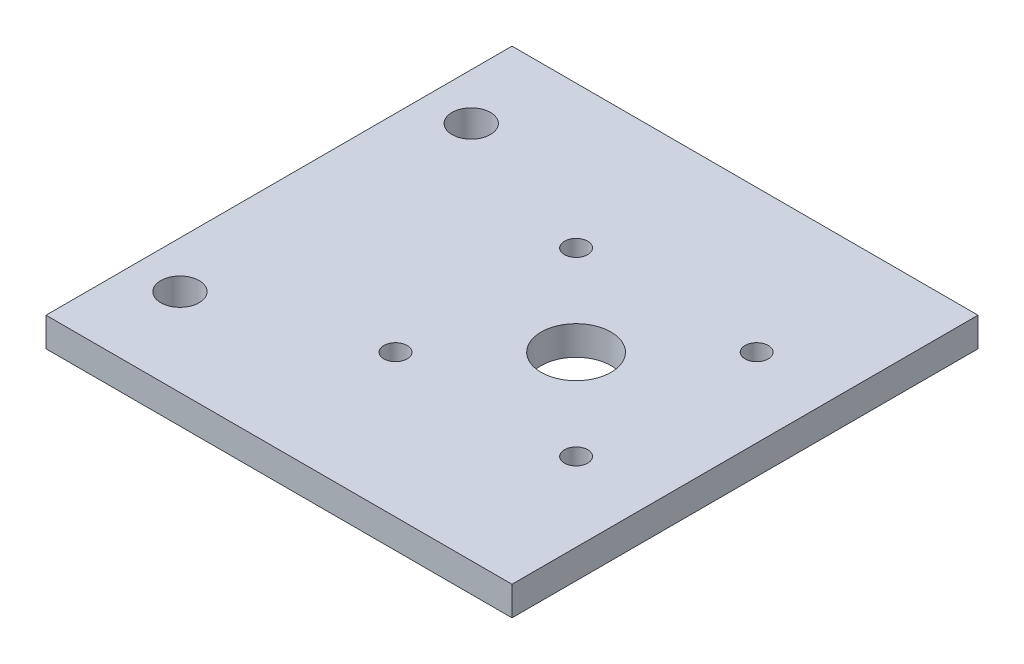
ISO-10303-21;
HEADER;
FILE_DESCRIPTION(('STEP AP214'),'2;1');
FILE_NAME('part.step','',(''),(''),'','','');
FILE_SCHEMA(('AUTOMOTIVE_DESIGN { 1 0 10303 214 1 1 1 1 }'));
ENDSEC;
DATA;
#1=APPLICATION_CONTEXT('core data for automotive mechanical design processes');
#2=APPLICATION_PROTOCOL_DEFINITION('international standard','automotive_design',2000,#1);
#3=PRODUCT_CONTEXT('',#1,'mechanical');
#4=PRODUCT('Part','Part','',(#3));
#5=PRODUCT_RELATED_PRODUCT_CATEGORY('part','',(#4));
#6=PRODUCT_DEFINITION_FORMATION('','',#4);
#7=PRODUCT_DEFINITION_CONTEXT('part definition',#1,'design');
#8=PRODUCT_DEFINITION('design','',#6,#7);
#9=PRODUCT_DEFINITION_SHAPE('','',#8);
#10=(LENGTH_UNIT() NAMED_UNIT(*) SI_UNIT(.MILLI.,.METRE.));
#11=(NAMED_UNIT(*) PLANE_ANGLE_UNIT() SI_UNIT($,.RADIAN.));
#12=(NAMED_UNIT(*) SI_UNIT($,.STERADIAN.) SOLID_ANGLE_UNIT());
#13=UNCERTAINTY_MEASURE_WITH_UNIT(LENGTH_MEASURE(1.E-05),#10,'distance_accuracy_value','');
#14=(GEOMETRIC_REPRESENTATION_CONTEXT(3) GLOBAL_UNCERTAINTY_ASSIGNED_CONTEXT((#13)) GLOBAL_UNIT_ASSIGNED_CONTEXT((#10,
#11,#12)) REPRESENTATION_CONTEXT('',''));
#15=CARTESIAN_POINT('',(0.,0.,0.));
#16=DIRECTION('',(0.,0.,1.));
#17=DIRECTION('',(1.,0.,0.));
#18=AXIS2_PLACEMENT_3D('',#15,#16,#17);
#19=CARTESIAN_POINT('',(0.,0.,80.));
#20=DIRECTION('',(1.,0.,0.));
#21=DIRECTION('',(0.,0.,-1.));
#22=AXIS2_PLACEMENT_3D('',#19,#20,#21);
#23=PLANE('',#22);
#24=DIRECTION('',(0.,-1.,0.));
#25=VECTOR('',#24,1.);
#26=CARTESIAN_POINT('',(0.,0.,0.));
#27=LINE('',#26,#25);
#28=CARTESIAN_POINT('',(0.,5.,0.));
#29=VERTEX_POINT('',#28);
#30=CARTESIAN_POINT('',(0.,0.,0.));
#31=VERTEX_POINT('',#30);
#32=EDGE_CURVE('E96',#29,#31,#27,.T.);
#33=ORIENTED_EDGE('',*,*,#32,.T.);
#34=DIRECTION('',(0.,0.,-1.));
#35=VECTOR('',#34,1.);
#36=CARTESIAN_POINT('',(0.,0.,80.));
#37=LINE('',#36,#35);
#38=CARTESIAN_POINT('',(0.,0.,80.));
#39=VERTEX_POINT('',#38);
#40=EDGE_CURVE('E11',#39,#31,#37,.T.);
#41=ORIENTED_EDGE('',*,*,#40,.F.);
#42=DIRECTION('',(0.,-1.,0.));
#43=VECTOR('',#42,1.);
#44=CARTESIAN_POINT('',(0.,0.,80.));
#45=LINE('',#44,#43);
#46=CARTESIAN_POINT('',(0.,5.,80.));
#47=VERTEX_POINT('',#46);
#48=EDGE_CURVE('E84',#47,#39,#45,.T.);
#49=ORIENTED_EDGE('',*,*,#48,.F.);
#50=DIRECTION('',(0.,0.,-1.));
#51=VECTOR('',#50,1.);
#52=CARTESIAN_POINT('',(0.,5.,80.));
#53=LINE('',#52,#51);
#54=EDGE_CURVE('E92',#47,#29,#53,.T.);
#55=ORIENTED_EDGE('',*,*,#54,.T.);
#56=EDGE_LOOP('',(#33,#41,#49,#55));
#57=FACE_BOUND('',#56,.T.);
#58=ADVANCED_FACE('F33',(#57),#23,.F.);
#59=CARTESIAN_POINT('',(0.,0.,80.));
#60=DIRECTION('',(0.,1.,0.));
#61=DIRECTION('',(0.,0.,1.));
#62=AXIS2_PLACEMENT_3D('',#59,#60,#61);
#63=PLANE('',#62);
#64=CARTESIAN_POINT('',(35.5,0.,55.5));
#65=DIRECTION('',(0.,1.,0.));
#66=DIRECTION('',(0.,0.,1.));
#67=AXIS2_PLACEMENT_3D('',#64,#65,#66);
#68=CIRCLE('',#67,2.);
#69=CARTESIAN_POINT('',(35.5,0.,57.5));
#70=VERTEX_POINT('',#69);
#71=EDGE_CURVE('E143',#70,#70,#68,.T.);
#72=ORIENTED_EDGE('',*,*,#71,.T.);
#73=EDGE_LOOP('',(#72));
#74=FACE_BOUND('',#73,.T.);
#75=CARTESIAN_POINT('',(66.5,0.,55.5));
#76=DIRECTION('',(0.,1.,0.));
#77=DIRECTION('',(0.,0.,1.));
#78=AXIS2_PLACEMENT_3D('',#75,#76,#77);
#79=CIRCLE('',#78,2.);
#80=CARTESIAN_POINT('',(66.5,0.,57.5));
#81=VERTEX_POINT('',#80);
#82=EDGE_CURVE('E137',#81,#81,#79,.T.);
#83=ORIENTED_EDGE('',*,*,#82,.T.);
#84=EDGE_LOOP('',(#83));
#85=FACE_BOUND('',#84,.T.);
#86=CARTESIAN_POINT('',(66.5,0.,24.5));
#87=DIRECTION('',(0.,1.,0.));
#88=DIRECTION('',(0.,0.,1.));
#89=AXIS2_PLACEMENT_3D('',#86,#87,#88);
#90=CIRCLE('',#89,2.);
#91=CARTESIAN_POINT('',(66.5,0.,26.5));
#92=VERTEX_POINT('',#91);
#93=EDGE_CURVE('E131',#92,#92,#90,.T.);
#94=ORIENTED_EDGE('',*,*,#93,.T.);
#95=EDGE_LOOP('',(#94));
#96=FACE_BOUND('',#95,.T.);
#97=CARTESIAN_POINT('',(35.5,0.,24.5));
#98=DIRECTION('',(0.,1.,0.));
#99=DIRECTION('',(0.,0.,1.));
#100=AXIS2_PLACEMENT_3D('',#97,#98,#99);
#101=CIRCLE('',#100,2.);
#102=CARTESIAN_POINT('',(35.5,0.,26.5));
#103=VERTEX_POINT('',#102);
#104=EDGE_CURVE('E125',#103,#103,#101,.T.);
#105=ORIENTED_EDGE('',*,*,#104,.T.);
#106=EDGE_LOOP('',(#105));
#107=FACE_BOUND('',#106,.T.);
#108=CARTESIAN_POINT('',(51.,0.,40.));
#109=DIRECTION('',(0.,1.,0.));
#110=DIRECTION('',(0.,0.,1.));
#111=AXIS2_PLACEMENT_3D('',#108,#109,#110);
#112=CIRCLE('',#111,5.99999999999999);
#113=CARTESIAN_POINT('',(51.,0.,46.));
#114=VERTEX_POINT('',#113);
#115=EDGE_CURVE('E121',#114,#114,#112,.T.);
#116=ORIENTED_EDGE('',*,*,#115,.T.);
#117=EDGE_LOOP('',(#116));
#118=FACE_BOUND('',#117,.T.);
#119=CARTESIAN_POINT('',(8.,0.,15.));
#120=DIRECTION('',(0.,1.,0.));
#121=DIRECTION('',(0.,0.,1.));
#122=AXIS2_PLACEMENT_3D('',#119,#120,#121);
#123=CIRCLE('',#122,3.3);
#124=CARTESIAN_POINT('',(8.,0.,18.3));
#125=VERTEX_POINT('',#124);
#126=EDGE_CURVE('E115',#125,#125,#123,.T.);
#127=ORIENTED_EDGE('',*,*,#126,.T.);
#128=EDGE_LOOP('',(#127));
#129=FACE_BOUND('',#128,.T.);
#130=CARTESIAN_POINT('',(8.,0.,65.));
#131=DIRECTION('',(0.,1.,0.));
#132=DIRECTION('',(0.,0.,1.));
#133=AXIS2_PLACEMENT_3D('',#130,#131,#132);
#134=CIRCLE('',#133,3.3);
#135=CARTESIAN_POINT('',(8.,0.,68.3));
#136=VERTEX_POINT('',#135);
#137=EDGE_CURVE('E99',#136,#136,#134,.T.);
#138=ORIENTED_EDGE('',*,*,#137,.T.);
#139=EDGE_LOOP('',(#138));
#140=FACE_BOUND('',#139,.T.);
#141=DIRECTION('',(1.,0.,0.));
#142=VECTOR('',#141,1.);
#143=CARTESIAN_POINT('',(0.,0.,0.));
#144=LINE('',#143,#142);
#145=CARTESIAN_POINT('',(80.,0.,0.));
#146=VERTEX_POINT('',#145);
#147=EDGE_CURVE('E88',#31,#146,#144,.T.);
#148=ORIENTED_EDGE('',*,*,#147,.T.);
#149=DIRECTION('',(0.,0.,-1.));
#150=VECTOR('',#149,1.);
#151=CARTESIAN_POINT('',(80.,0.,80.));
#152=LINE('',#151,#150);
#153=CARTESIAN_POINT('',(80.,0.,80.));
#154=VERTEX_POINT('',#153);
#155=EDGE_CURVE('E41',#154,#146,#152,.T.);
#156=ORIENTED_EDGE('',*,*,#155,.F.);
#157=DIRECTION('',(1.,0.,0.));
#158=VECTOR('',#157,1.);
#159=CARTESIAN_POINT('',(0.,0.,80.));
#160=LINE('',#159,#158);
#161=EDGE_CURVE('E79',#39,#154,#160,.T.);
#162=ORIENTED_EDGE('',*,*,#161,.F.);
#163=ORIENTED_EDGE('',*,*,#40,.T.);
#164=EDGE_LOOP('',(#148,#156,#162,#163));
#165=FACE_BOUND('',#164,.T.);
#166=ADVANCED_FACE('F87',(#74,#85,#96,#107,#118,#129,#140,#165),#63,.F.);
#167=CARTESIAN_POINT('',(80.,0.,80.));
#168=DIRECTION('',(-1.,0.,0.));
#169=DIRECTION('',(0.,0.,1.));
#170=AXIS2_PLACEMENT_3D('',#167,#168,#169);
#171=PLANE('',#170);
#172=DIRECTION('',(0.,1.,0.));
#173=VECTOR('',#172,1.);
#174=CARTESIAN_POINT('',(80.,0.,0.));
#175=LINE('',#174,#173);
#176=CARTESIAN_POINT('',(80.,5.,0.));
#177=VERTEX_POINT('',#176);
#178=EDGE_CURVE('E66',#146,#177,#175,.T.);
#179=ORIENTED_EDGE('',*,*,#178,.T.);
#180=DIRECTION('',(0.,0.,-1.));
#181=VECTOR('',#180,1.);
#182=CARTESIAN_POINT('',(80.,5.,80.));
#183=LINE('',#182,#181);
#184=CARTESIAN_POINT('',(80.,5.,80.));
#185=VERTEX_POINT('',#184);
#186=EDGE_CURVE('E89',#185,#177,#183,.T.);
#187=ORIENTED_EDGE('',*,*,#186,.F.);
#188=DIRECTION('',(0.,1.,0.));
#189=VECTOR('',#188,1.);
#190=CARTESIAN_POINT('',(80.,0.,80.));
#191=LINE('',#190,#189);
#192=EDGE_CURVE('E82',#154,#185,#191,.T.);
#193=ORIENTED_EDGE('',*,*,#192,.F.);
#194=ORIENTED_EDGE('',*,*,#155,.T.);
#195=EDGE_LOOP('',(#179,#187,#193,#194));
#196=FACE_BOUND('',#195,.T.);
#197=ADVANCED_FACE('F90',(#196),#171,.F.);
#198=CARTESIAN_POINT('',(0.,5.,80.));
#199=DIRECTION('',(0.,-1.,0.));
#200=DIRECTION('',(0.,0.,-1.));
#201=AXIS2_PLACEMENT_3D('',#198,#199,#200);
#202=PLANE('',#201);
#203=CARTESIAN_POINT('',(35.5,5.,55.5));
#204=DIRECTION('',(0.,1.,0.));
#205=DIRECTION('',(0.,0.,1.));
#206=AXIS2_PLACEMENT_3D('',#203,#204,#205);
#207=CIRCLE('',#206,2.);
#208=CARTESIAN_POINT('',(35.5,5.,57.5));
#209=VERTEX_POINT('',#208);
#210=EDGE_CURVE('E146',#209,#209,#207,.T.);
#211=ORIENTED_EDGE('',*,*,#210,.F.);
#212=EDGE_LOOP('',(#211));
#213=FACE_BOUND('',#212,.T.);
#214=CARTESIAN_POINT('',(66.5,5.,55.5));
#215=DIRECTION('',(0.,1.,0.));
#216=DIRECTION('',(0.,0.,1.));
#217=AXIS2_PLACEMENT_3D('',#214,#215,#216);
#218=CIRCLE('',#217,2.);
#219=CARTESIAN_POINT('',(66.5,5.,57.5));
#220=VERTEX_POINT('',#219);
#221=EDGE_CURVE('E140',#220,#220,#218,.T.);
#222=ORIENTED_EDGE('',*,*,#221,.F.);
#223=EDGE_LOOP('',(#222));
#224=FACE_BOUND('',#223,.T.);
#225=CARTESIAN_POINT('',(66.5,5.,24.5));
#226=DIRECTION('',(0.,1.,0.));
#227=DIRECTION('',(0.,0.,1.));
#228=AXIS2_PLACEMENT_3D('',#225,#226,#227);
#229=CIRCLE('',#228,2.);
#230=CARTESIAN_POINT('',(66.5,5.,26.5));
#231=VERTEX_POINT('',#230);
#232=EDGE_CURVE('E134',#231,#231,#229,.T.);
#233=ORIENTED_EDGE('',*,*,#232,.F.);
#234=EDGE_LOOP('',(#233));
#235=FACE_BOUND('',#234,.T.);
#236=CARTESIAN_POINT('',(35.5,5.,24.5));
#237=DIRECTION('',(0.,1.,0.));
#238=DIRECTION('',(0.,0.,1.));
#239=AXIS2_PLACEMENT_3D('',#236,#237,#238);
#240=CIRCLE('',#239,2.);
#241=CARTESIAN_POINT('',(35.5,5.,26.5));
#242=VERTEX_POINT('',#241);
#243=EDGE_CURVE('E128',#242,#242,#240,.T.);
#244=ORIENTED_EDGE('',*,*,#243,.F.);
#245=EDGE_LOOP('',(#244));
#246=FACE_BOUND('',#245,.T.);
#247=CARTESIAN_POINT('',(51.,5.,40.));
#248=DIRECTION('',(0.,1.,0.));
#249=DIRECTION('',(0.,0.,1.));
#250=AXIS2_PLACEMENT_3D('',#247,#248,#249);
#251=CIRCLE('',#250,5.99999999999999);
#252=CARTESIAN_POINT('',(51.,5.,46.));
#253=VERTEX_POINT('',#252);
#254=EDGE_CURVE('E122',#253,#253,#251,.T.);
#255=ORIENTED_EDGE('',*,*,#254,.F.);
#256=EDGE_LOOP('',(#255));
#257=FACE_BOUND('',#256,.T.);
#258=CARTESIAN_POINT('',(8.,5.,15.));
#259=DIRECTION('',(0.,1.,0.));
#260=DIRECTION('',(0.,0.,1.));
#261=AXIS2_PLACEMENT_3D('',#258,#259,#260);
#262=CIRCLE('',#261,3.29999999999999);
#263=CARTESIAN_POINT('',(8.,5.,18.3));
#264=VERTEX_POINT('',#263);
#265=EDGE_CURVE('E118',#264,#264,#262,.T.);
#266=ORIENTED_EDGE('',*,*,#265,.F.);
#267=EDGE_LOOP('',(#266));
#268=FACE_BOUND('',#267,.T.);
#269=CARTESIAN_POINT('',(8.,5.,65.));
#270=DIRECTION('',(0.,1.,0.));
#271=DIRECTION('',(0.,0.,1.));
#272=AXIS2_PLACEMENT_3D('',#269,#270,#271);
#273=CIRCLE('',#272,3.29999999999999);
#274=CARTESIAN_POINT('',(8.,5.,68.3));
#275=VERTEX_POINT('',#274);
#276=EDGE_CURVE('E112',#275,#275,#273,.T.);
#277=ORIENTED_EDGE('',*,*,#276,.F.);
#278=EDGE_LOOP('',(#277));
#279=FACE_BOUND('',#278,.T.);
#280=DIRECTION('',(-1.,0.,0.));
#281=VECTOR('',#280,1.);
#282=CARTESIAN_POINT('',(0.,5.,0.));
#283=LINE('',#282,#281);
#284=EDGE_CURVE('E72',#177,#29,#283,.T.);
#285=ORIENTED_EDGE('',*,*,#284,.T.);
#286=ORIENTED_EDGE('',*,*,#54,.F.);
#287=DIRECTION('',(-1.,0.,0.));
#288=VECTOR('',#287,1.);
#289=CARTESIAN_POINT('',(0.,5.,80.));
#290=LINE('',#289,#288);
#291=EDGE_CURVE('E49',#185,#47,#290,.T.);
#292=ORIENTED_EDGE('',*,*,#291,.F.);
#293=ORIENTED_EDGE('',*,*,#186,.T.);
#294=EDGE_LOOP('',(#285,#286,#292,#293));
#295=FACE_BOUND('',#294,.T.);
#296=ADVANCED_FACE('F104',(#213,#224,#235,#246,#257,#268,#279,#295),#202,.F.);
#297=CARTESIAN_POINT('',(0.,0.,80.));
#298=DIRECTION('',(0.,0.,-1.));
#299=DIRECTION('',(-1.,0.,0.));
#300=AXIS2_PLACEMENT_3D('',#297,#298,#299);
#301=PLANE('',#300);
#302=ORIENTED_EDGE('',*,*,#48,.T.);
#303=ORIENTED_EDGE('',*,*,#161,.T.);
#304=ORIENTED_EDGE('',*,*,#192,.T.);
#305=ORIENTED_EDGE('',*,*,#291,.T.);
#306=EDGE_LOOP('',(#302,#303,#304,#305));
#307=FACE_BOUND('',#306,.T.);
#308=ADVANCED_FACE('F80',(#307),#301,.F.);
#309=CARTESIAN_POINT('',(0.,0.,0.));
#310=DIRECTION('',(0.,0.,-1.));
#311=DIRECTION('',(-1.,0.,0.));
#312=AXIS2_PLACEMENT_3D('',#309,#310,#311);
#313=PLANE('',#312);
#314=ORIENTED_EDGE('',*,*,#32,.F.);
#315=ORIENTED_EDGE('',*,*,#284,.F.);
#316=ORIENTED_EDGE('',*,*,#178,.F.);
#317=ORIENTED_EDGE('',*,*,#147,.F.);
#318=EDGE_LOOP('',(#314,#315,#316,#317));
#319=FACE_BOUND('',#318,.T.);
#320=ADVANCED_FACE('F107',(#319),#313,.T.);
#321=CARTESIAN_POINT('',(8.,5.,65.));
#322=DIRECTION('',(0.,1.,0.));
#323=DIRECTION('',(0.,0.,1.));
#324=AXIS2_PLACEMENT_3D('',#321,#322,#323);
#325=CYLINDRICAL_SURFACE('',#324,3.29999999999999);
#326=ORIENTED_EDGE('',*,*,#137,.F.);
#327=EDGE_LOOP('',(#326));
#328=FACE_BOUND('',#327,.T.);
#329=ORIENTED_EDGE('',*,*,#276,.T.);
#330=EDGE_LOOP('',(#329));
#331=FACE_BOUND('',#330,.T.);
#332=ADVANCED_FACE('F176',(#328,#331),#325,.F.);
#333=CARTESIAN_POINT('',(8.,5.,15.));
#334=DIRECTION('',(0.,1.,0.));
#335=DIRECTION('',(0.,0.,1.));
#336=AXIS2_PLACEMENT_3D('',#333,#334,#335);
#337=CYLINDRICAL_SURFACE('',#336,3.29999999999999);
#338=ORIENTED_EDGE('',*,*,#126,.F.);
#339=EDGE_LOOP('',(#338));
#340=FACE_BOUND('',#339,.T.);
#341=ORIENTED_EDGE('',*,*,#265,.T.);
#342=EDGE_LOOP('',(#341));
#343=FACE_BOUND('',#342,.T.);
#344=ADVANCED_FACE('F178',(#340,#343),#337,.F.);
#345=CARTESIAN_POINT('',(51.,0.,40.));
#346=DIRECTION('',(0.,1.,0.));
#347=DIRECTION('',(0.,0.,1.));
#348=AXIS2_PLACEMENT_3D('',#345,#346,#347);
#349=CYLINDRICAL_SURFACE('',#348,5.99999999999999);
#350=ORIENTED_EDGE('',*,*,#115,.F.);
#351=EDGE_LOOP('',(#350));
#352=FACE_BOUND('',#351,.T.);
#353=ORIENTED_EDGE('',*,*,#254,.T.);
#354=EDGE_LOOP('',(#353));
#355=FACE_BOUND('',#354,.T.);
#356=ADVANCED_FACE('F185',(#352,#355),#349,.F.);
#357=CARTESIAN_POINT('',(35.5,0.,24.5));
#358=DIRECTION('',(0.,1.,0.));
#359=DIRECTION('',(0.,0.,1.));
#360=AXIS2_PLACEMENT_3D('',#357,#358,#359);
#361=CYLINDRICAL_SURFACE('',#360,2.);
#362=ORIENTED_EDGE('',*,*,#104,.F.);
#363=EDGE_LOOP('',(#362));
#364=FACE_BOUND('',#363,.T.);
#365=ORIENTED_EDGE('',*,*,#243,.T.);
#366=EDGE_LOOP('',(#365));
#367=FACE_BOUND('',#366,.T.);
#368=ADVANCED_FACE('F227',(#364,#367),#361,.F.);
#369=CARTESIAN_POINT('',(66.5,0.,24.5));
#370=DIRECTION('',(0.,1.,0.));
#371=DIRECTION('',(0.,0.,1.));
#372=AXIS2_PLACEMENT_3D('',#369,#370,#371);
#373=CYLINDRICAL_SURFACE('',#372,2.);
#374=ORIENTED_EDGE('',*,*,#93,.F.);
#375=EDGE_LOOP('',(#374));
#376=FACE_BOUND('',#375,.T.);
#377=ORIENTED_EDGE('',*,*,#232,.T.);
#378=EDGE_LOOP('',(#377));
#379=FACE_BOUND('',#378,.T.);
#380=ADVANCED_FACE('F248',(#376,#379),#373,.F.);
#381=CARTESIAN_POINT('',(66.5,0.,55.5));
#382=DIRECTION('',(0.,1.,0.));
#383=DIRECTION('',(0.,0.,1.));
#384=AXIS2_PLACEMENT_3D('',#381,#382,#383);
#385=CYLINDRICAL_SURFACE('',#384,2.);
#386=ORIENTED_EDGE('',*,*,#82,.F.);
#387=EDGE_LOOP('',(#386));
#388=FACE_BOUND('',#387,.T.);
#389=ORIENTED_EDGE('',*,*,#221,.T.);
#390=EDGE_LOOP('',(#389));
#391=FACE_BOUND('',#390,.T.);
#392=ADVANCED_FACE('F157',(#388,#391),#385,.F.);
#393=CARTESIAN_POINT('',(35.5,0.,55.5));
#394=DIRECTION('',(0.,1.,0.));
#395=DIRECTION('',(0.,0.,1.));
#396=AXIS2_PLACEMENT_3D('',#393,#394,#395);
#397=CYLINDRICAL_SURFACE('',#396,2.);
#398=ORIENTED_EDGE('',*,*,#71,.F.);
#399=EDGE_LOOP('',(#398));
#400=FACE_BOUND('',#399,.T.);
#401=ORIENTED_EDGE('',*,*,#210,.T.);
#402=EDGE_LOOP('',(#401));
#403=FACE_BOUND('',#402,.T.);
#404=ADVANCED_FACE('F154',(#400,#403),#397,.F.);
#405=CLOSED_SHELL('',(#58,#166,#197,#296,#308,#320,#332,#344,#356,#368,#380,#392,#404));
#406=MANIFOLD_SOLID_BREP('B2',#405);
#407=ADVANCED_BREP_SHAPE_REPRESENTATION('',(#18,#406),#14);
#408=SHAPE_DEFINITION_REPRESENTATION(#9,#407);
ENDSEC;
END-ISO-10303-21;
